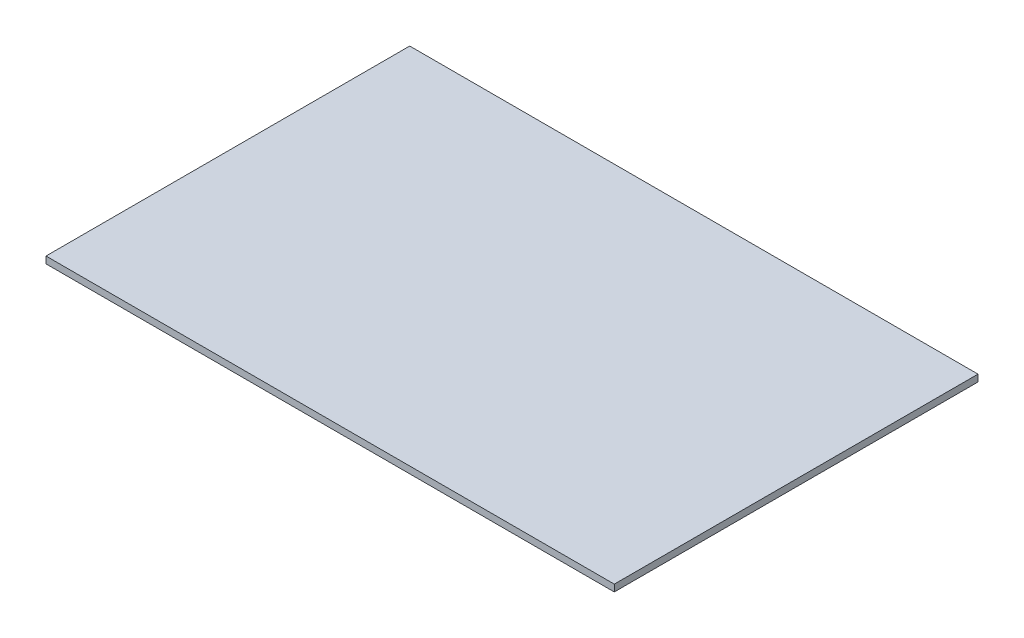
ISO-10303-21;
HEADER;
FILE_DESCRIPTION(('STEP AP214'),'2;1');
FILE_NAME('part.step','',(''),(''),'','','');
FILE_SCHEMA(('AUTOMOTIVE_DESIGN { 1 0 10303 214 1 1 1 1 }'));
ENDSEC;
DATA;
#1=APPLICATION_CONTEXT('core data for automotive mechanical design processes');
#2=APPLICATION_PROTOCOL_DEFINITION('international standard','automotive_design',2000,#1);
#3=PRODUCT_CONTEXT('',#1,'mechanical');
#4=PRODUCT('Part','Part','',(#3));
#5=PRODUCT_RELATED_PRODUCT_CATEGORY('part','',(#4));
#6=PRODUCT_DEFINITION_FORMATION('','',#4);
#7=PRODUCT_DEFINITION_CONTEXT('part definition',#1,'design');
#8=PRODUCT_DEFINITION('design','',#6,#7);
#9=PRODUCT_DEFINITION_SHAPE('','',#8);
#10=(LENGTH_UNIT() NAMED_UNIT(*) SI_UNIT(.MILLI.,.METRE.));
#11=(NAMED_UNIT(*) PLANE_ANGLE_UNIT() SI_UNIT($,.RADIAN.));
#12=(NAMED_UNIT(*) SI_UNIT($,.STERADIAN.) SOLID_ANGLE_UNIT());
#13=UNCERTAINTY_MEASURE_WITH_UNIT(LENGTH_MEASURE(1.E-05),#10,'distance_accuracy_value','');
#14=(GEOMETRIC_REPRESENTATION_CONTEXT(3) GLOBAL_UNCERTAINTY_ASSIGNED_CONTEXT((#13)) GLOBAL_UNIT_ASSIGNED_CONTEXT((#10,
#11,#12)) REPRESENTATION_CONTEXT('',''));
#15=CARTESIAN_POINT('',(0.,0.,0.));
#16=DIRECTION('',(0.,0.,1.));
#17=DIRECTION('',(1.,0.,0.));
#18=AXIS2_PLACEMENT_3D('',#15,#16,#17);
#19=CARTESIAN_POINT('',(0.,0.,0.));
#20=DIRECTION('',(0.,1.,0.));
#21=DIRECTION('',(1.,0.,0.));
#22=AXIS2_PLACEMENT_3D('',#19,#20,#21);
#23=PLANE('',#22);
#24=DIRECTION('',(0.,0.,-1.));
#25=VECTOR('',#24,1.);
#26=CARTESIAN_POINT('',(125.,0.,80.));
#27=LINE('',#26,#25);
#28=CARTESIAN_POINT('',(125.,0.,80.));
#29=VERTEX_POINT('',#28);
#30=CARTESIAN_POINT('',(125.,0.,-80.));
#31=VERTEX_POINT('',#30);
#32=EDGE_CURVE('E27',#29,#31,#27,.T.);
#33=ORIENTED_EDGE('',*,*,#32,.F.);
#34=DIRECTION('',(1.,0.,0.));
#35=VECTOR('',#34,1.);
#36=CARTESIAN_POINT('',(-125.,0.,80.));
#37=LINE('',#36,#35);
#38=CARTESIAN_POINT('',(-125.,0.,80.));
#39=VERTEX_POINT('',#38);
#40=EDGE_CURVE('E126',#39,#29,#37,.T.);
#41=ORIENTED_EDGE('',*,*,#40,.F.);
#42=DIRECTION('',(0.,0.,1.));
#43=VECTOR('',#42,1.);
#44=CARTESIAN_POINT('',(-125.,0.,-80.));
#45=LINE('',#44,#43);
#46=CARTESIAN_POINT('',(-125.,0.,-80.));
#47=VERTEX_POINT('',#46);
#48=EDGE_CURVE('E83',#47,#39,#45,.T.);
#49=ORIENTED_EDGE('',*,*,#48,.F.);
#50=DIRECTION('',(-1.,0.,0.));
#51=VECTOR('',#50,1.);
#52=CARTESIAN_POINT('',(125.,0.,-80.));
#53=LINE('',#52,#51);
#54=EDGE_CURVE('E70',#31,#47,#53,.T.);
#55=ORIENTED_EDGE('',*,*,#54,.F.);
#56=EDGE_LOOP('',(#33,#41,#49,#55));
#57=FACE_BOUND('',#56,.T.);
#58=ADVANCED_FACE('F17',(#57),#23,.F.);
#59=CARTESIAN_POINT('',(0.,3.,0.));
#60=DIRECTION('',(0.,1.,0.));
#61=DIRECTION('',(1.,0.,0.));
#62=AXIS2_PLACEMENT_3D('',#59,#60,#61);
#63=PLANE('',#62);
#64=DIRECTION('',(0.,0.,-1.));
#65=VECTOR('',#64,1.);
#66=CARTESIAN_POINT('',(125.,3.,80.));
#67=LINE('',#66,#65);
#68=CARTESIAN_POINT('',(125.,3.,80.));
#69=VERTEX_POINT('',#68);
#70=CARTESIAN_POINT('',(125.,3.,-80.));
#71=VERTEX_POINT('',#70);
#72=EDGE_CURVE('E11',#69,#71,#67,.T.);
#73=ORIENTED_EDGE('',*,*,#72,.T.);
#74=DIRECTION('',(-1.,0.,0.));
#75=VECTOR('',#74,1.);
#76=CARTESIAN_POINT('',(125.,3.,-80.));
#77=LINE('',#76,#75);
#78=CARTESIAN_POINT('',(-125.,3.,-80.));
#79=VERTEX_POINT('',#78);
#80=EDGE_CURVE('E60',#71,#79,#77,.T.);
#81=ORIENTED_EDGE('',*,*,#80,.T.);
#82=DIRECTION('',(0.,0.,1.));
#83=VECTOR('',#82,1.);
#84=CARTESIAN_POINT('',(-125.,3.,-80.));
#85=LINE('',#84,#83);
#86=CARTESIAN_POINT('',(-125.,3.,80.));
#87=VERTEX_POINT('',#86);
#88=EDGE_CURVE('E61',#79,#87,#85,.T.);
#89=ORIENTED_EDGE('',*,*,#88,.T.);
#90=DIRECTION('',(1.,0.,0.));
#91=VECTOR('',#90,1.);
#92=CARTESIAN_POINT('',(-125.,3.,80.));
#93=LINE('',#92,#91);
#94=EDGE_CURVE('E109',#87,#69,#93,.T.);
#95=ORIENTED_EDGE('',*,*,#94,.T.);
#96=EDGE_LOOP('',(#73,#81,#89,#95));
#97=FACE_BOUND('',#96,.T.);
#98=ADVANCED_FACE('F56',(#97),#63,.T.);
#99=CARTESIAN_POINT('',(125.,0.,80.));
#100=DIRECTION('',(1.,0.,0.));
#101=DIRECTION('',(0.,1.,0.));
#102=AXIS2_PLACEMENT_3D('',#99,#100,#101);
#103=PLANE('',#102);
#104=ORIENTED_EDGE('',*,*,#32,.T.);
#105=DIRECTION('',(0.,1.,0.));
#106=VECTOR('',#105,1.);
#107=CARTESIAN_POINT('',(125.,0.,-80.));
#108=LINE('',#107,#106);
#109=EDGE_CURVE('E66',#31,#71,#108,.T.);
#110=ORIENTED_EDGE('',*,*,#109,.T.);
#111=ORIENTED_EDGE('',*,*,#72,.F.);
#112=DIRECTION('',(0.,1.,0.));
#113=VECTOR('',#112,1.);
#114=CARTESIAN_POINT('',(125.,0.,80.));
#115=LINE('',#114,#113);
#116=EDGE_CURVE('E107',#29,#69,#115,.T.);
#117=ORIENTED_EDGE('',*,*,#116,.F.);
#118=EDGE_LOOP('',(#104,#110,#111,#117));
#119=FACE_BOUND('',#118,.T.);
#120=ADVANCED_FACE('F100',(#119),#103,.T.);
#121=CARTESIAN_POINT('',(125.,0.,-80.));
#122=DIRECTION('',(0.,0.,-1.));
#123=DIRECTION('',(0.,-1.,0.));
#124=AXIS2_PLACEMENT_3D('',#121,#122,#123);
#125=PLANE('',#124);
#126=ORIENTED_EDGE('',*,*,#54,.T.);
#127=DIRECTION('',(0.,1.,0.));
#128=VECTOR('',#127,1.);
#129=CARTESIAN_POINT('',(-125.,0.,-80.));
#130=LINE('',#129,#128);
#131=EDGE_CURVE('E69',#47,#79,#130,.T.);
#132=ORIENTED_EDGE('',*,*,#131,.T.);
#133=ORIENTED_EDGE('',*,*,#80,.F.);
#134=ORIENTED_EDGE('',*,*,#109,.F.);
#135=EDGE_LOOP('',(#126,#132,#133,#134));
#136=FACE_BOUND('',#135,.T.);
#137=ADVANCED_FACE('F75',(#136),#125,.T.);
#138=CARTESIAN_POINT('',(-125.,0.,-80.));
#139=DIRECTION('',(-1.,0.,0.));
#140=DIRECTION('',(0.,0.,1.));
#141=AXIS2_PLACEMENT_3D('',#138,#139,#140);
#142=PLANE('',#141);
#143=ORIENTED_EDGE('',*,*,#48,.T.);
#144=DIRECTION('',(0.,1.,0.));
#145=VECTOR('',#144,1.);
#146=CARTESIAN_POINT('',(-125.,0.,80.));
#147=LINE('',#146,#145);
#148=EDGE_CURVE('E79',#39,#87,#147,.T.);
#149=ORIENTED_EDGE('',*,*,#148,.T.);
#150=ORIENTED_EDGE('',*,*,#88,.F.);
#151=ORIENTED_EDGE('',*,*,#131,.F.);
#152=EDGE_LOOP('',(#143,#149,#150,#151));
#153=FACE_BOUND('',#152,.T.);
#154=ADVANCED_FACE('F77',(#153),#142,.T.);
#155=CARTESIAN_POINT('',(-125.,0.,80.));
#156=DIRECTION('',(0.,0.,1.));
#157=DIRECTION('',(1.,0.,0.));
#158=AXIS2_PLACEMENT_3D('',#155,#156,#157);
#159=PLANE('',#158);
#160=ORIENTED_EDGE('',*,*,#40,.T.);
#161=ORIENTED_EDGE('',*,*,#116,.T.);
#162=ORIENTED_EDGE('',*,*,#94,.F.);
#163=ORIENTED_EDGE('',*,*,#148,.F.);
#164=EDGE_LOOP('',(#160,#161,#162,#163));
#165=FACE_BOUND('',#164,.T.);
#166=ADVANCED_FACE('F136',(#165),#159,.T.);
#167=CLOSED_SHELL('',(#58,#98,#120,#137,#154,#166));
#168=MANIFOLD_SOLID_BREP('B1',#167);
#169=ADVANCED_BREP_SHAPE_REPRESENTATION('',(#18,#168),#14);
#170=SHAPE_DEFINITION_REPRESENTATION(#9,#169);
ENDSEC;
END-ISO-10303-21;
